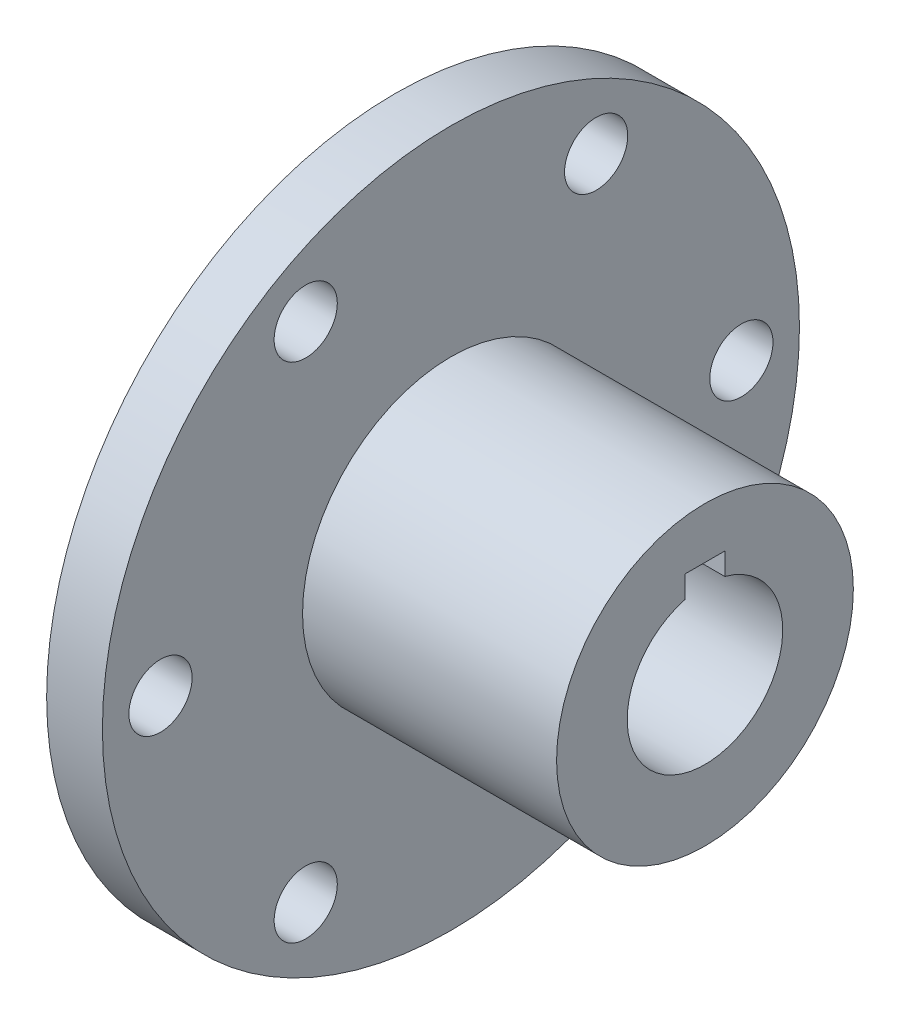
ISO-10303-21;
HEADER;
FILE_DESCRIPTION(('STEP AP214'),'2;1');
FILE_NAME('part.step','',(''),(''),'','','');
FILE_SCHEMA(('AUTOMOTIVE_DESIGN { 1 0 10303 214 1 1 1 1 }'));
ENDSEC;
DATA;
#1=APPLICATION_CONTEXT('core data for automotive mechanical design processes');
#2=APPLICATION_PROTOCOL_DEFINITION('international standard','automotive_design',2000,#1);
#3=PRODUCT_CONTEXT('',#1,'mechanical');
#4=PRODUCT('Part','Part','',(#3));
#5=PRODUCT_RELATED_PRODUCT_CATEGORY('part','',(#4));
#6=PRODUCT_DEFINITION_FORMATION('','',#4);
#7=PRODUCT_DEFINITION_CONTEXT('part definition',#1,'design');
#8=PRODUCT_DEFINITION('design','',#6,#7);
#9=PRODUCT_DEFINITION_SHAPE('','',#8);
#10=(LENGTH_UNIT() NAMED_UNIT(*) SI_UNIT(.MILLI.,.METRE.));
#11=(NAMED_UNIT(*) PLANE_ANGLE_UNIT() SI_UNIT($,.RADIAN.));
#12=(NAMED_UNIT(*) SI_UNIT($,.STERADIAN.) SOLID_ANGLE_UNIT());
#13=UNCERTAINTY_MEASURE_WITH_UNIT(LENGTH_MEASURE(1.E-05),#10,'distance_accuracy_value','');
#14=(GEOMETRIC_REPRESENTATION_CONTEXT(3) GLOBAL_UNCERTAINTY_ASSIGNED_CONTEXT((#13)) GLOBAL_UNIT_ASSIGNED_CONTEXT((#10,
#11,#12)) REPRESENTATION_CONTEXT('',''));
#15=CARTESIAN_POINT('',(0.,0.,0.));
#16=DIRECTION('',(0.,0.,1.));
#17=DIRECTION('',(1.,0.,0.));
#18=AXIS2_PLACEMENT_3D('',#15,#16,#17);
#19=CARTESIAN_POINT('',(-13.0350662460568,0.,0.));
#20=DIRECTION('',(1.,0.,0.));
#21=DIRECTION('',(0.,0.,-1.));
#22=AXIS2_PLACEMENT_3D('',#19,#20,#21);
#23=PLANE('',#22);
#24=CARTESIAN_POINT('',(-13.0350662460568,0.,23.8125));
#25=DIRECTION('',(1.,0.,0.));
#26=DIRECTION('',(0.,0.,-1.));
#27=AXIS2_PLACEMENT_3D('',#24,#25,#26);
#28=CIRCLE('',#27,2.59080000000001);
#29=CARTESIAN_POINT('',(-13.0350662460568,0.,21.2217));
#30=VERTEX_POINT('',#29);
#31=EDGE_CURVE('E179',#30,#30,#28,.T.);
#32=ORIENTED_EDGE('',*,*,#31,.F.);
#33=EDGE_LOOP('',(#32));
#34=FACE_BOUND('',#33,.T.);
#35=CARTESIAN_POINT('',(-13.0350662460568,20.6222299276169,11.90625));
#36=DIRECTION('',(1.,0.,0.));
#37=DIRECTION('',(0.,0.,-1.));
#38=AXIS2_PLACEMENT_3D('',#35,#36,#37);
#39=CIRCLE('',#38,2.59080000000001);
#40=CARTESIAN_POINT('',(-13.0350662460568,20.6222299276169,9.31544999999999));
#41=VERTEX_POINT('',#40);
#42=EDGE_CURVE('E189',#41,#41,#39,.T.);
#43=ORIENTED_EDGE('',*,*,#42,.F.);
#44=EDGE_LOOP('',(#43));
#45=FACE_BOUND('',#44,.T.);
#46=CARTESIAN_POINT('',(-13.0350662460568,20.6222299276169,-11.90625));
#47=DIRECTION('',(1.,0.,0.));
#48=DIRECTION('',(0.,0.,-1.));
#49=AXIS2_PLACEMENT_3D('',#46,#47,#48);
#50=CIRCLE('',#49,2.59080000000001);
#51=CARTESIAN_POINT('',(-13.0350662460568,20.6222299276169,-14.49705));
#52=VERTEX_POINT('',#51);
#53=EDGE_CURVE('E195',#52,#52,#50,.T.);
#54=ORIENTED_EDGE('',*,*,#53,.F.);
#55=EDGE_LOOP('',(#54));
#56=FACE_BOUND('',#55,.T.);
#57=CARTESIAN_POINT('',(-13.0350662460568,0.,-23.8125));
#58=DIRECTION('',(1.,0.,0.));
#59=DIRECTION('',(0.,0.,-1.));
#60=AXIS2_PLACEMENT_3D('',#57,#58,#59);
#61=CIRCLE('',#60,2.59080000000001);
#62=CARTESIAN_POINT('',(-13.0350662460568,0.,-26.4033));
#63=VERTEX_POINT('',#62);
#64=EDGE_CURVE('E201',#63,#63,#61,.T.);
#65=ORIENTED_EDGE('',*,*,#64,.F.);
#66=EDGE_LOOP('',(#65));
#67=FACE_BOUND('',#66,.T.);
#68=CARTESIAN_POINT('',(-13.0350662460568,-20.6222299276169,-11.90625));
#69=DIRECTION('',(1.,0.,0.));
#70=DIRECTION('',(0.,0.,-1.));
#71=AXIS2_PLACEMENT_3D('',#68,#69,#70);
#72=CIRCLE('',#71,2.59080000000001);
#73=CARTESIAN_POINT('',(-13.0350662460568,-20.6222299276169,-14.49705));
#74=VERTEX_POINT('',#73);
#75=EDGE_CURVE('E207',#74,#74,#72,.T.);
#76=ORIENTED_EDGE('',*,*,#75,.F.);
#77=EDGE_LOOP('',(#76));
#78=FACE_BOUND('',#77,.T.);
#79=CARTESIAN_POINT('',(-13.0350662460568,-20.6222299276169,11.90625));
#80=DIRECTION('',(1.,0.,0.));
#81=DIRECTION('',(0.,0.,-1.));
#82=AXIS2_PLACEMENT_3D('',#79,#80,#81);
#83=CIRCLE('',#82,2.59080000000001);
#84=CARTESIAN_POINT('',(-13.0350662460568,-20.6222299276169,9.31544999999996));
#85=VERTEX_POINT('',#84);
#86=EDGE_CURVE('E91',#85,#85,#83,.T.);
#87=ORIENTED_EDGE('',*,*,#86,.F.);
#88=EDGE_LOOP('',(#87));
#89=FACE_BOUND('',#88,.T.);
#90=CARTESIAN_POINT('',(-13.0350662460568,0.,0.));
#91=DIRECTION('',(1.,0.,0.));
#92=DIRECTION('',(0.,0.,-1.));
#93=AXIS2_PLACEMENT_3D('',#90,#91,#92);
#94=CIRCLE('',#93,28.575);
#95=CARTESIAN_POINT('',(-13.0350662460568,0.,-28.575));
#96=VERTEX_POINT('',#95);
#97=EDGE_CURVE('E40',#96,#96,#94,.T.);
#98=ORIENTED_EDGE('',*,*,#97,.T.);
#99=EDGE_LOOP('',(#98));
#100=FACE_BOUND('',#99,.T.);
#101=CARTESIAN_POINT('',(-13.0350662460568,0.,0.));
#102=DIRECTION('',(1.,0.,0.));
#103=DIRECTION('',(0.,0.,-1.));
#104=AXIS2_PLACEMENT_3D('',#101,#102,#103);
#105=CIRCLE('',#104,12.1666);
#106=CARTESIAN_POINT('',(-13.0350662460568,0.,-12.1666));
#107=VERTEX_POINT('',#106);
#108=EDGE_CURVE('E79',#107,#107,#105,.T.);
#109=ORIENTED_EDGE('',*,*,#108,.F.);
#110=EDGE_LOOP('',(#109));
#111=FACE_BOUND('',#110,.T.);
#112=ADVANCED_FACE('F32',(#34,#45,#56,#67,#78,#89,#100,#111),#23,.T.);
#113=CARTESIAN_POINT('',(-17.6070662460568,0.,0.));
#114=DIRECTION('',(1.,0.,0.));
#115=DIRECTION('',(0.,0.,-1.));
#116=AXIS2_PLACEMENT_3D('',#113,#114,#115);
#117=CYLINDRICAL_SURFACE('',#116,28.575);
#118=CARTESIAN_POINT('',(-17.6070662460568,0.,0.));
#119=DIRECTION('',(1.,0.,0.));
#120=DIRECTION('',(0.,0.,-1.));
#121=AXIS2_PLACEMENT_3D('',#118,#119,#120);
#122=CIRCLE('',#121,28.575);
#123=CARTESIAN_POINT('',(-17.6070662460568,0.,-28.575));
#124=VERTEX_POINT('',#123);
#125=EDGE_CURVE('E11',#124,#124,#122,.T.);
#126=ORIENTED_EDGE('',*,*,#125,.T.);
#127=EDGE_LOOP('',(#126));
#128=FACE_BOUND('',#127,.T.);
#129=ORIENTED_EDGE('',*,*,#97,.F.);
#130=EDGE_LOOP('',(#129));
#131=FACE_BOUND('',#130,.T.);
#132=ADVANCED_FACE('F34',(#128,#131),#117,.T.);
#133=CARTESIAN_POINT('',(-17.6070662460568,28.575,0.));
#134=DIRECTION('',(-1.,0.,0.));
#135=DIRECTION('',(0.,0.,1.));
#136=AXIS2_PLACEMENT_3D('',#133,#134,#135);
#137=PLANE('',#136);
#138=CARTESIAN_POINT('',(-17.6070662460568,0.,23.8125));
#139=DIRECTION('',(-1.,0.,0.));
#140=DIRECTION('',(0.,0.,1.));
#141=AXIS2_PLACEMENT_3D('',#138,#139,#140);
#142=CIRCLE('',#141,2.59080000000001);
#143=CARTESIAN_POINT('',(-17.6070662460568,0.,26.4033));
#144=VERTEX_POINT('',#143);
#145=EDGE_CURVE('E182',#144,#144,#142,.T.);
#146=ORIENTED_EDGE('',*,*,#145,.F.);
#147=EDGE_LOOP('',(#146));
#148=FACE_BOUND('',#147,.T.);
#149=CARTESIAN_POINT('',(-17.6070662460568,20.6222299276169,11.90625));
#150=DIRECTION('',(-1.,0.,0.));
#151=DIRECTION('',(0.,0.,1.));
#152=AXIS2_PLACEMENT_3D('',#149,#150,#151);
#153=CIRCLE('',#152,2.59080000000001);
#154=CARTESIAN_POINT('',(-17.6070662460568,20.6222299276169,14.49705));
#155=VERTEX_POINT('',#154);
#156=EDGE_CURVE('E184',#155,#155,#153,.T.);
#157=ORIENTED_EDGE('',*,*,#156,.F.);
#158=EDGE_LOOP('',(#157));
#159=FACE_BOUND('',#158,.T.);
#160=CARTESIAN_POINT('',(-17.6070662460568,20.6222299276169,-11.90625));
#161=DIRECTION('',(-1.,0.,0.));
#162=DIRECTION('',(0.,0.,1.));
#163=AXIS2_PLACEMENT_3D('',#160,#161,#162);
#164=CIRCLE('',#163,2.59080000000001);
#165=CARTESIAN_POINT('',(-17.6070662460568,20.6222299276169,-9.31544999999999));
#166=VERTEX_POINT('',#165);
#167=EDGE_CURVE('E192',#166,#166,#164,.T.);
#168=ORIENTED_EDGE('',*,*,#167,.F.);
#169=EDGE_LOOP('',(#168));
#170=FACE_BOUND('',#169,.T.);
#171=CARTESIAN_POINT('',(-17.6070662460568,0.,-23.8125));
#172=DIRECTION('',(-1.,0.,0.));
#173=DIRECTION('',(0.,0.,1.));
#174=AXIS2_PLACEMENT_3D('',#171,#172,#173);
#175=CIRCLE('',#174,2.59080000000001);
#176=CARTESIAN_POINT('',(-17.6070662460568,0.,-21.2217));
#177=VERTEX_POINT('',#176);
#178=EDGE_CURVE('E198',#177,#177,#175,.T.);
#179=ORIENTED_EDGE('',*,*,#178,.F.);
#180=EDGE_LOOP('',(#179));
#181=FACE_BOUND('',#180,.T.);
#182=CARTESIAN_POINT('',(-17.6070662460568,-20.6222299276169,-11.90625));
#183=DIRECTION('',(-1.,0.,0.));
#184=DIRECTION('',(0.,0.,1.));
#185=AXIS2_PLACEMENT_3D('',#182,#183,#184);
#186=CIRCLE('',#185,2.59080000000001);
#187=CARTESIAN_POINT('',(-17.6070662460568,-20.6222299276169,-9.31544999999999));
#188=VERTEX_POINT('',#187);
#189=EDGE_CURVE('E204',#188,#188,#186,.T.);
#190=ORIENTED_EDGE('',*,*,#189,.F.);
#191=EDGE_LOOP('',(#190));
#192=FACE_BOUND('',#191,.T.);
#193=CARTESIAN_POINT('',(-17.6070662460568,-20.6222299276169,11.90625));
#194=DIRECTION('',(-1.,0.,0.));
#195=DIRECTION('',(0.,0.,1.));
#196=AXIS2_PLACEMENT_3D('',#193,#194,#195);
#197=CIRCLE('',#196,2.59080000000001);
#198=CARTESIAN_POINT('',(-17.6070662460568,-20.6222299276169,14.49705));
#199=VERTEX_POINT('',#198);
#200=EDGE_CURVE('E210',#199,#199,#197,.T.);
#201=ORIENTED_EDGE('',*,*,#200,.F.);
#202=EDGE_LOOP('',(#201));
#203=FACE_BOUND('',#202,.T.);
#204=CARTESIAN_POINT('',(-17.6070662460568,0.,0.));
#205=DIRECTION('',(-1.,0.,0.));
#206=DIRECTION('',(0.,0.,1.));
#207=AXIS2_PLACEMENT_3D('',#204,#205,#206);
#208=CIRCLE('',#207,6.3754);
#209=CARTESIAN_POINT('',(-17.6070662460568,6.16466948019113,-1.6256));
#210=VERTEX_POINT('',#209);
#211=CARTESIAN_POINT('',(-17.6070662460568,6.16466948019113,1.6256));
#212=VERTEX_POINT('',#211);
#213=EDGE_CURVE('E47',#210,#212,#208,.T.);
#214=ORIENTED_EDGE('',*,*,#213,.F.);
#215=DIRECTION('',(0.,-1.,0.));
#216=VECTOR('',#215,1.);
#217=CARTESIAN_POINT('',(-17.6070662460568,7.9756,-1.6256));
#218=LINE('',#217,#216);
#219=CARTESIAN_POINT('',(-17.6070662460568,7.9756,-1.6256));
#220=VERTEX_POINT('',#219);
#221=EDGE_CURVE('E88',#220,#210,#218,.T.);
#222=ORIENTED_EDGE('',*,*,#221,.F.);
#223=DIRECTION('',(0.,0.,-1.));
#224=VECTOR('',#223,1.);
#225=CARTESIAN_POINT('',(-17.6070662460568,7.9756,1.6256));
#226=LINE('',#225,#224);
#227=CARTESIAN_POINT('',(-17.6070662460568,7.9756,1.6256));
#228=VERTEX_POINT('',#227);
#229=EDGE_CURVE('E96',#228,#220,#226,.T.);
#230=ORIENTED_EDGE('',*,*,#229,.F.);
#231=DIRECTION('',(0.,1.,0.));
#232=VECTOR('',#231,1.);
#233=CARTESIAN_POINT('',(-17.6070662460568,6.16466948019113,1.6256));
#234=LINE('',#233,#232);
#235=EDGE_CURVE('E90',#212,#228,#234,.T.);
#236=ORIENTED_EDGE('',*,*,#235,.F.);
#237=EDGE_LOOP('',(#214,#222,#230,#236));
#238=FACE_BOUND('',#237,.T.);
#239=ORIENTED_EDGE('',*,*,#125,.F.);
#240=EDGE_LOOP('',(#239));
#241=FACE_BOUND('',#240,.T.);
#242=ADVANCED_FACE('F85',(#148,#159,#170,#181,#192,#203,#238,#241),#137,.T.);
#243=CARTESIAN_POINT('',(7.79293375394323,0.,0.));
#244=DIRECTION('',(-1.,0.,0.));
#245=DIRECTION('',(0.,0.,1.));
#246=AXIS2_PLACEMENT_3D('',#243,#244,#245);
#247=CYLINDRICAL_SURFACE('',#246,12.1666);
#248=CARTESIAN_POINT('',(7.79293375394323,0.,0.));
#249=DIRECTION('',(1.,0.,0.));
#250=DIRECTION('',(0.,0.,-1.));
#251=AXIS2_PLACEMENT_3D('',#248,#249,#250);
#252=CIRCLE('',#251,12.1666);
#253=CARTESIAN_POINT('',(7.79293375394323,0.,-12.1666));
#254=VERTEX_POINT('',#253);
#255=EDGE_CURVE('E109',#254,#254,#252,.T.);
#256=ORIENTED_EDGE('',*,*,#255,.F.);
#257=EDGE_LOOP('',(#256));
#258=FACE_BOUND('',#257,.T.);
#259=ORIENTED_EDGE('',*,*,#108,.T.);
#260=EDGE_LOOP('',(#259));
#261=FACE_BOUND('',#260,.T.);
#262=ADVANCED_FACE('F124',(#258,#261),#247,.T.);
#263=CARTESIAN_POINT('',(7.79293375394323,0.,0.));
#264=DIRECTION('',(1.,0.,0.));
#265=DIRECTION('',(0.,0.,-1.));
#266=AXIS2_PLACEMENT_3D('',#263,#264,#265);
#267=PLANE('',#266);
#268=CARTESIAN_POINT('',(7.79293375394323,0.,0.));
#269=DIRECTION('',(-1.,0.,0.));
#270=DIRECTION('',(0.,0.,1.));
#271=AXIS2_PLACEMENT_3D('',#268,#269,#270);
#272=CIRCLE('',#271,6.3754);
#273=CARTESIAN_POINT('',(7.79293375394323,6.16466948019113,-1.6256));
#274=VERTEX_POINT('',#273);
#275=CARTESIAN_POINT('',(7.79293375394323,6.16466948019113,1.6256));
#276=VERTEX_POINT('',#275);
#277=EDGE_CURVE('E74',#274,#276,#272,.T.);
#278=ORIENTED_EDGE('',*,*,#277,.T.);
#279=DIRECTION('',(0.,1.,0.));
#280=VECTOR('',#279,1.);
#281=CARTESIAN_POINT('',(7.79293375394323,6.16466948019113,1.6256));
#282=LINE('',#281,#280);
#283=CARTESIAN_POINT('',(7.79293375394323,7.9756,1.6256));
#284=VERTEX_POINT('',#283);
#285=EDGE_CURVE('E95',#276,#284,#282,.T.);
#286=ORIENTED_EDGE('',*,*,#285,.T.);
#287=DIRECTION('',(0.,0.,-1.));
#288=VECTOR('',#287,1.);
#289=CARTESIAN_POINT('',(7.79293375394323,7.9756,1.6256));
#290=LINE('',#289,#288);
#291=CARTESIAN_POINT('',(7.79293375394323,7.9756,-1.6256));
#292=VERTEX_POINT('',#291);
#293=EDGE_CURVE('E55',#284,#292,#290,.T.);
#294=ORIENTED_EDGE('',*,*,#293,.T.);
#295=DIRECTION('',(0.,-1.,0.));
#296=VECTOR('',#295,1.);
#297=CARTESIAN_POINT('',(7.79293375394323,7.9756,-1.6256));
#298=LINE('',#297,#296);
#299=EDGE_CURVE('E108',#292,#274,#298,.T.);
#300=ORIENTED_EDGE('',*,*,#299,.T.);
#301=EDGE_LOOP('',(#278,#286,#294,#300));
#302=FACE_BOUND('',#301,.T.);
#303=ORIENTED_EDGE('',*,*,#255,.T.);
#304=EDGE_LOOP('',(#303));
#305=FACE_BOUND('',#304,.T.);
#306=ADVANCED_FACE('F136',(#302,#305),#267,.T.);
#307=CARTESIAN_POINT('',(7.79293375394323,7.9756,-1.6256));
#308=DIRECTION('',(0.,0.,-1.));
#309=DIRECTION('',(0.,1.,0.));
#310=AXIS2_PLACEMENT_3D('',#307,#308,#309);
#311=PLANE('',#310);
#312=ORIENTED_EDGE('',*,*,#221,.T.);
#313=DIRECTION('',(-1.,0.,0.));
#314=VECTOR('',#313,1.);
#315=CARTESIAN_POINT('',(7.79293375394323,6.16466948019113,-1.6256));
#316=LINE('',#315,#314);
#317=EDGE_CURVE('E71',#274,#210,#316,.T.);
#318=ORIENTED_EDGE('',*,*,#317,.F.);
#319=ORIENTED_EDGE('',*,*,#299,.F.);
#320=DIRECTION('',(-1.,0.,0.));
#321=VECTOR('',#320,1.);
#322=CARTESIAN_POINT('',(7.79293375394323,7.9756,-1.6256));
#323=LINE('',#322,#321);
#324=EDGE_CURVE('E80',#292,#220,#323,.T.);
#325=ORIENTED_EDGE('',*,*,#324,.T.);
#326=EDGE_LOOP('',(#312,#318,#319,#325));
#327=FACE_BOUND('',#326,.T.);
#328=ADVANCED_FACE('F93',(#327),#311,.F.);
#329=CARTESIAN_POINT('',(7.79293375394323,7.9756,1.6256));
#330=DIRECTION('',(0.,1.,0.));
#331=DIRECTION('',(0.,0.,1.));
#332=AXIS2_PLACEMENT_3D('',#329,#330,#331);
#333=PLANE('',#332);
#334=ORIENTED_EDGE('',*,*,#229,.T.);
#335=ORIENTED_EDGE('',*,*,#324,.F.);
#336=ORIENTED_EDGE('',*,*,#293,.F.);
#337=DIRECTION('',(-1.,0.,0.));
#338=VECTOR('',#337,1.);
#339=CARTESIAN_POINT('',(7.79293375394323,7.9756,1.6256));
#340=LINE('',#339,#338);
#341=EDGE_CURVE('E104',#284,#228,#340,.T.);
#342=ORIENTED_EDGE('',*,*,#341,.T.);
#343=EDGE_LOOP('',(#334,#335,#336,#342));
#344=FACE_BOUND('',#343,.T.);
#345=ADVANCED_FACE('F144',(#344),#333,.F.);
#346=CARTESIAN_POINT('',(7.79293375394323,6.16466948019113,1.6256));
#347=DIRECTION('',(0.,0.,1.));
#348=DIRECTION('',(1.,0.,0.));
#349=AXIS2_PLACEMENT_3D('',#346,#347,#348);
#350=PLANE('',#349);
#351=ORIENTED_EDGE('',*,*,#235,.T.);
#352=ORIENTED_EDGE('',*,*,#341,.F.);
#353=ORIENTED_EDGE('',*,*,#285,.F.);
#354=DIRECTION('',(-1.,0.,0.));
#355=VECTOR('',#354,1.);
#356=CARTESIAN_POINT('',(7.79293375394323,6.16466948019113,1.6256));
#357=LINE('',#356,#355);
#358=EDGE_CURVE('E106',#276,#212,#357,.T.);
#359=ORIENTED_EDGE('',*,*,#358,.T.);
#360=EDGE_LOOP('',(#351,#352,#353,#359));
#361=FACE_BOUND('',#360,.T.);
#362=ADVANCED_FACE('F141',(#361),#350,.F.);
#363=CARTESIAN_POINT('',(7.79293375394323,0.,0.));
#364=DIRECTION('',(-1.,0.,0.));
#365=DIRECTION('',(0.,0.,1.));
#366=AXIS2_PLACEMENT_3D('',#363,#364,#365);
#367=CYLINDRICAL_SURFACE('',#366,6.3754);
#368=ORIENTED_EDGE('',*,*,#213,.T.);
#369=ORIENTED_EDGE('',*,*,#358,.F.);
#370=ORIENTED_EDGE('',*,*,#277,.F.);
#371=ORIENTED_EDGE('',*,*,#317,.T.);
#372=EDGE_LOOP('',(#368,#369,#370,#371));
#373=FACE_BOUND('',#372,.T.);
#374=ADVANCED_FACE('F72',(#373),#367,.F.);
#375=CARTESIAN_POINT('',(-17.6070662460568,-20.6222299276169,11.90625));
#376=DIRECTION('',(-1.,0.,0.));
#377=DIRECTION('',(0.,0.,1.));
#378=AXIS2_PLACEMENT_3D('',#375,#376,#377);
#379=CYLINDRICAL_SURFACE('',#378,2.59080000000001);
#380=ORIENTED_EDGE('',*,*,#86,.T.);
#381=EDGE_LOOP('',(#380));
#382=FACE_BOUND('',#381,.T.);
#383=ORIENTED_EDGE('',*,*,#200,.T.);
#384=EDGE_LOOP('',(#383));
#385=FACE_BOUND('',#384,.T.);
#386=ADVANCED_FACE('F152',(#382,#385),#379,.F.);
#387=CARTESIAN_POINT('',(-17.6070662460568,-20.6222299276169,-11.90625));
#388=DIRECTION('',(-1.,0.,0.));
#389=DIRECTION('',(0.,0.,1.));
#390=AXIS2_PLACEMENT_3D('',#387,#388,#389);
#391=CYLINDRICAL_SURFACE('',#390,2.59080000000001);
#392=ORIENTED_EDGE('',*,*,#75,.T.);
#393=EDGE_LOOP('',(#392));
#394=FACE_BOUND('',#393,.T.);
#395=ORIENTED_EDGE('',*,*,#189,.T.);
#396=EDGE_LOOP('',(#395));
#397=FACE_BOUND('',#396,.T.);
#398=ADVANCED_FACE('F155',(#394,#397),#391,.F.);
#399=CARTESIAN_POINT('',(-17.6070662460568,0.,-23.8125));
#400=DIRECTION('',(-1.,0.,0.));
#401=DIRECTION('',(0.,0.,1.));
#402=AXIS2_PLACEMENT_3D('',#399,#400,#401);
#403=CYLINDRICAL_SURFACE('',#402,2.59080000000001);
#404=ORIENTED_EDGE('',*,*,#64,.T.);
#405=EDGE_LOOP('',(#404));
#406=FACE_BOUND('',#405,.T.);
#407=ORIENTED_EDGE('',*,*,#178,.T.);
#408=EDGE_LOOP('',(#407));
#409=FACE_BOUND('',#408,.T.);
#410=ADVANCED_FACE('F159',(#406,#409),#403,.F.);
#411=CARTESIAN_POINT('',(-17.6070662460568,20.6222299276169,-11.90625));
#412=DIRECTION('',(-1.,0.,0.));
#413=DIRECTION('',(0.,0.,1.));
#414=AXIS2_PLACEMENT_3D('',#411,#412,#413);
#415=CYLINDRICAL_SURFACE('',#414,2.59080000000001);
#416=ORIENTED_EDGE('',*,*,#53,.T.);
#417=EDGE_LOOP('',(#416));
#418=FACE_BOUND('',#417,.T.);
#419=ORIENTED_EDGE('',*,*,#167,.T.);
#420=EDGE_LOOP('',(#419));
#421=FACE_BOUND('',#420,.T.);
#422=ADVANCED_FACE('F163',(#418,#421),#415,.F.);
#423=CARTESIAN_POINT('',(-17.6070662460568,20.6222299276169,11.90625));
#424=DIRECTION('',(-1.,0.,0.));
#425=DIRECTION('',(0.,0.,1.));
#426=AXIS2_PLACEMENT_3D('',#423,#424,#425);
#427=CYLINDRICAL_SURFACE('',#426,2.59080000000001);
#428=ORIENTED_EDGE('',*,*,#42,.T.);
#429=EDGE_LOOP('',(#428));
#430=FACE_BOUND('',#429,.T.);
#431=ORIENTED_EDGE('',*,*,#156,.T.);
#432=EDGE_LOOP('',(#431));
#433=FACE_BOUND('',#432,.T.);
#434=ADVANCED_FACE('F167',(#430,#433),#427,.F.);
#435=CARTESIAN_POINT('',(-17.6070662460568,0.,23.8125));
#436=DIRECTION('',(-1.,0.,0.));
#437=DIRECTION('',(0.,0.,1.));
#438=AXIS2_PLACEMENT_3D('',#435,#436,#437);
#439=CYLINDRICAL_SURFACE('',#438,2.59080000000001);
#440=ORIENTED_EDGE('',*,*,#31,.T.);
#441=EDGE_LOOP('',(#440));
#442=FACE_BOUND('',#441,.T.);
#443=ORIENTED_EDGE('',*,*,#145,.T.);
#444=EDGE_LOOP('',(#443));
#445=FACE_BOUND('',#444,.T.);
#446=ADVANCED_FACE('F171',(#442,#445),#439,.F.);
#447=CLOSED_SHELL('',(#112,#132,#242,#262,#306,#328,#345,#362,#374,#386,#398,#410,#422,#434,#446));
#448=MANIFOLD_SOLID_BREP('B2',#447);
#449=ADVANCED_BREP_SHAPE_REPRESENTATION('',(#18,#448),#14);
#450=SHAPE_DEFINITION_REPRESENTATION(#9,#449);
ENDSEC;
END-ISO-10303-21;
